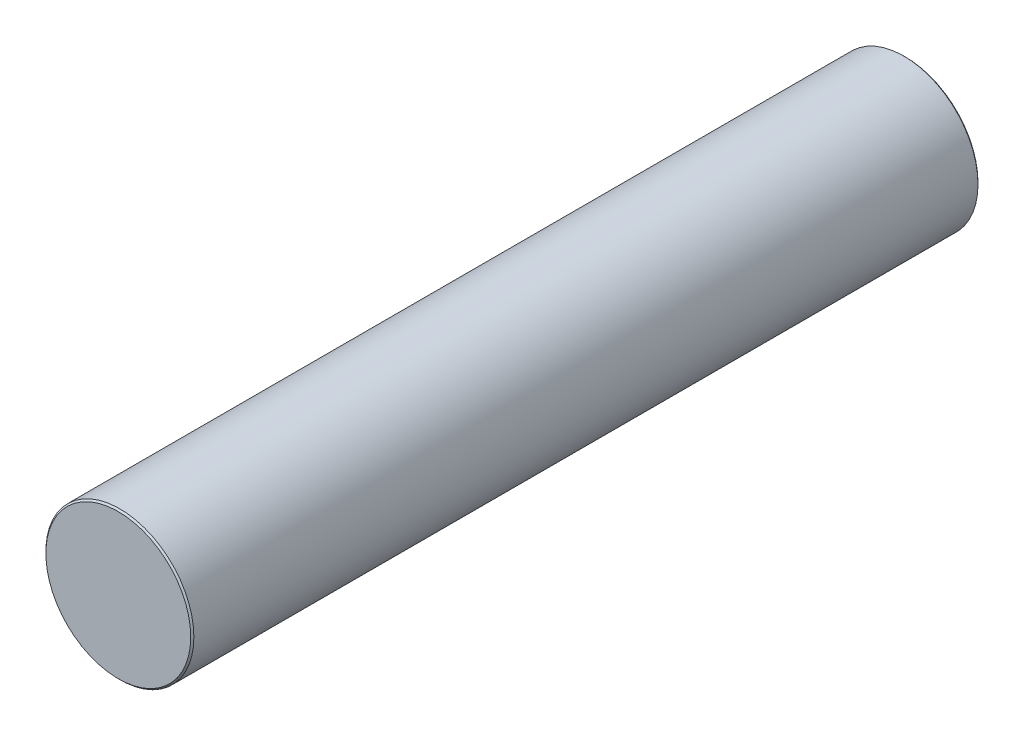
ISO-10303-21;
HEADER;
FILE_DESCRIPTION(('STEP AP214'),'2;1');
FILE_NAME('part.step','',(''),(''),'','','');
FILE_SCHEMA(('AUTOMOTIVE_DESIGN { 1 0 10303 214 1 1 1 1 }'));
ENDSEC;
DATA;
#1=APPLICATION_CONTEXT('core data for automotive mechanical design processes');
#2=APPLICATION_PROTOCOL_DEFINITION('international standard','automotive_design',2000,#1);
#3=PRODUCT_CONTEXT('',#1,'mechanical');
#4=PRODUCT('Part','Part','',(#3));
#5=PRODUCT_RELATED_PRODUCT_CATEGORY('part','',(#4));
#6=PRODUCT_DEFINITION_FORMATION('','',#4);
#7=PRODUCT_DEFINITION_CONTEXT('part definition',#1,'design');
#8=PRODUCT_DEFINITION('design','',#6,#7);
#9=PRODUCT_DEFINITION_SHAPE('','',#8);
#10=(LENGTH_UNIT() NAMED_UNIT(*) SI_UNIT(.MILLI.,.METRE.));
#11=(NAMED_UNIT(*) PLANE_ANGLE_UNIT() SI_UNIT($,.RADIAN.));
#12=(NAMED_UNIT(*) SI_UNIT($,.STERADIAN.) SOLID_ANGLE_UNIT());
#13=UNCERTAINTY_MEASURE_WITH_UNIT(LENGTH_MEASURE(1.E-05),#10,'distance_accuracy_value','');
#14=(GEOMETRIC_REPRESENTATION_CONTEXT(3) GLOBAL_UNCERTAINTY_ASSIGNED_CONTEXT((#13)) GLOBAL_UNIT_ASSIGNED_CONTEXT((#10,
#11,#12)) REPRESENTATION_CONTEXT('',''));
#15=CARTESIAN_POINT('',(0.,0.,0.));
#16=DIRECTION('',(0.,0.,1.));
#17=DIRECTION('',(1.,0.,0.));
#18=AXIS2_PLACEMENT_3D('',#15,#16,#17);
#19=CARTESIAN_POINT('',(0.,0.,25.));
#20=DIRECTION('',(0.,0.,-1.));
#21=DIRECTION('',(-1.,0.,0.));
#22=AXIS2_PLACEMENT_3D('',#19,#20,#21);
#23=CYLINDRICAL_SURFACE('',#22,2.35);
#24=CARTESIAN_POINT('',(0.,0.,24.95));
#25=DIRECTION('',(0.,0.,1.));
#26=DIRECTION('',(1.,0.,0.));
#27=AXIS2_PLACEMENT_3D('',#24,#25,#26);
#28=CIRCLE('',#27,2.35);
#29=CARTESIAN_POINT('',(2.35,0.,24.95));
#30=VERTEX_POINT('',#29);
#31=EDGE_CURVE('E54',#30,#30,#28,.F.);
#32=ORIENTED_EDGE('',*,*,#31,.T.);
#33=EDGE_LOOP('',(#32));
#34=FACE_BOUND('',#33,.T.);
#35=CARTESIAN_POINT('',(0.,0.,0.049999999999998));
#36=DIRECTION('',(0.,0.,1.));
#37=DIRECTION('',(1.,0.,0.));
#38=AXIS2_PLACEMENT_3D('',#35,#36,#37);
#39=CIRCLE('',#38,2.35);
#40=CARTESIAN_POINT('',(2.35,0.,0.049999999999998));
#41=VERTEX_POINT('',#40);
#42=EDGE_CURVE('E59',#41,#41,#39,.T.);
#43=ORIENTED_EDGE('',*,*,#42,.T.);
#44=EDGE_LOOP('',(#43));
#45=FACE_BOUND('',#44,.T.);
#46=ADVANCED_FACE('F45',(#34,#45),#23,.T.);
#47=CARTESIAN_POINT('',(0.,0.,25.));
#48=DIRECTION('',(0.,0.,1.));
#49=DIRECTION('',(1.,0.,0.));
#50=AXIS2_PLACEMENT_3D('',#47,#48,#49);
#51=PLANE('',#50);
#52=CARTESIAN_POINT('',(0.,0.,25.));
#53=DIRECTION('',(0.,0.,1.));
#54=DIRECTION('',(1.,0.,0.));
#55=AXIS2_PLACEMENT_3D('',#52,#53,#54);
#56=CIRCLE('',#55,2.3);
#57=CARTESIAN_POINT('',(2.3,0.,25.));
#58=VERTEX_POINT('',#57);
#59=EDGE_CURVE('E64',#58,#58,#56,.T.);
#60=ORIENTED_EDGE('',*,*,#59,.T.);
#61=EDGE_LOOP('',(#60));
#62=FACE_BOUND('',#61,.T.);
#63=ADVANCED_FACE('F71',(#62),#51,.T.);
#64=CARTESIAN_POINT('',(0.,0.,0.));
#65=DIRECTION('',(0.,0.,1.));
#66=DIRECTION('',(1.,0.,0.));
#67=AXIS2_PLACEMENT_3D('',#64,#65,#66);
#68=PLANE('',#67);
#69=CARTESIAN_POINT('',(0.,0.,0.));
#70=DIRECTION('',(0.,0.,1.));
#71=DIRECTION('',(1.,0.,0.));
#72=AXIS2_PLACEMENT_3D('',#69,#70,#71);
#73=CIRCLE('',#72,2.3);
#74=CARTESIAN_POINT('',(2.3,0.,0.));
#75=VERTEX_POINT('',#74);
#76=EDGE_CURVE('E10',#75,#75,#73,.F.);
#77=ORIENTED_EDGE('',*,*,#76,.T.);
#78=EDGE_LOOP('',(#77));
#79=FACE_BOUND('',#78,.T.);
#80=ADVANCED_FACE('F75',(#79),#68,.F.);
#81=CARTESIAN_POINT('',(0.,0.,25.));
#82=DIRECTION('',(0.,0.,-1.));
#83=DIRECTION('',(-1.,0.,0.));
#84=AXIS2_PLACEMENT_3D('',#81,#82,#83);
#85=CONICAL_SURFACE('',#84,2.3,0.78539816339747);
#86=ORIENTED_EDGE('',*,*,#31,.F.);
#87=EDGE_LOOP('',(#86));
#88=FACE_BOUND('',#87,.T.);
#89=ORIENTED_EDGE('',*,*,#59,.F.);
#90=EDGE_LOOP('',(#89));
#91=FACE_BOUND('',#90,.T.);
#92=ADVANCED_FACE('F73',(#88,#91),#85,.T.);
#93=CARTESIAN_POINT('',(0.,0.,0.049999999999998));
#94=DIRECTION('',(0.,0.,1.));
#95=DIRECTION('',(1.,0.,0.));
#96=AXIS2_PLACEMENT_3D('',#93,#94,#95);
#97=CONICAL_SURFACE('',#96,2.35,0.78539816339747);
#98=ORIENTED_EDGE('',*,*,#76,.F.);
#99=EDGE_LOOP('',(#98));
#100=FACE_BOUND('',#99,.T.);
#101=ORIENTED_EDGE('',*,*,#42,.F.);
#102=EDGE_LOOP('',(#101));
#103=FACE_BOUND('',#102,.T.);
#104=ADVANCED_FACE('F48',(#100,#103),#97,.T.);
#105=CLOSED_SHELL('',(#46,#63,#80,#92,#104));
#106=MANIFOLD_SOLID_BREP('B2',#105);
#107=ADVANCED_BREP_SHAPE_REPRESENTATION('',(#18,#106),#14);
#108=SHAPE_DEFINITION_REPRESENTATION(#9,#107);
ENDSEC;
END-ISO-10303-21;
